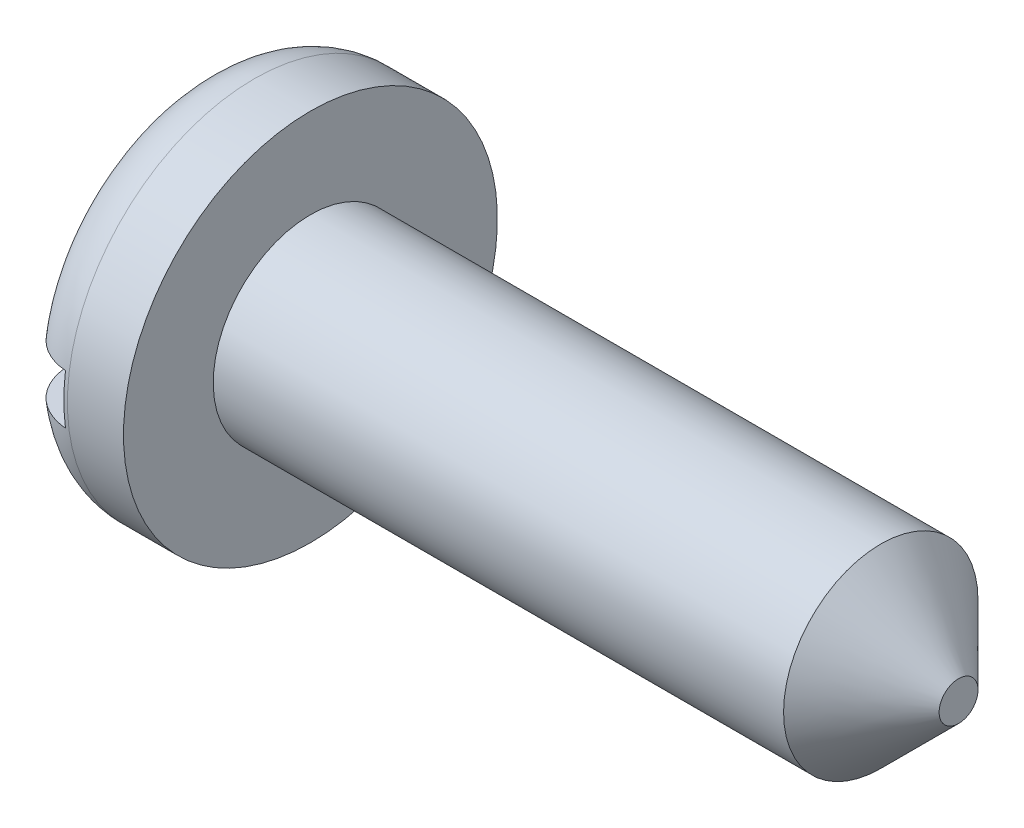
ISO-10303-21;
HEADER;
FILE_DESCRIPTION(('STEP AP214'),'2;1');
FILE_NAME('part.step','',(''),(''),'','','');
FILE_SCHEMA(('AUTOMOTIVE_DESIGN { 1 0 10303 214 1 1 1 1 }'));
ENDSEC;
DATA;
#1=APPLICATION_CONTEXT('core data for automotive mechanical design processes');
#2=APPLICATION_PROTOCOL_DEFINITION('international standard','automotive_design',2000,#1);
#3=PRODUCT_CONTEXT('',#1,'mechanical');
#4=PRODUCT('Part','Part','',(#3));
#5=PRODUCT_RELATED_PRODUCT_CATEGORY('part','',(#4));
#6=PRODUCT_DEFINITION_FORMATION('','',#4);
#7=PRODUCT_DEFINITION_CONTEXT('part definition',#1,'design');
#8=PRODUCT_DEFINITION('design','',#6,#7);
#9=PRODUCT_DEFINITION_SHAPE('','',#8);
#10=(LENGTH_UNIT() NAMED_UNIT(*) SI_UNIT(.MILLI.,.METRE.));
#11=(NAMED_UNIT(*) PLANE_ANGLE_UNIT() SI_UNIT($,.RADIAN.));
#12=(NAMED_UNIT(*) SI_UNIT($,.STERADIAN.) SOLID_ANGLE_UNIT());
#13=UNCERTAINTY_MEASURE_WITH_UNIT(LENGTH_MEASURE(1.E-05),#10,'distance_accuracy_value','');
#14=(GEOMETRIC_REPRESENTATION_CONTEXT(3) GLOBAL_UNCERTAINTY_ASSIGNED_CONTEXT((#13)) GLOBAL_UNIT_ASSIGNED_CONTEXT((#10,
#11,#12)) REPRESENTATION_CONTEXT('',''));
#15=CARTESIAN_POINT('',(0.,0.,0.));
#16=DIRECTION('',(0.,0.,1.));
#17=DIRECTION('',(1.,0.,0.));
#18=AXIS2_PLACEMENT_3D('',#15,#16,#17);
#19=CARTESIAN_POINT('',(0.,0.,0.));
#20=DIRECTION('',(-1.,0.,0.));
#21=DIRECTION('',(0.,-1.,0.));
#22=AXIS2_PLACEMENT_3D('',#19,#20,#21);
#23=PLANE('',#22);
#24=DIRECTION('',(0.,0.,1.));
#25=VECTOR('',#24,1.);
#26=CARTESIAN_POINT('',(0.,0.5,-3.75));
#27=LINE('',#26,#25);
#28=CARTESIAN_POINT('',(0.,0.5,-2.57694101601108));
#29=VERTEX_POINT('',#28);
#30=CARTESIAN_POINT('',(0.,0.5,2.57694101603312));
#31=VERTEX_POINT('',#30);
#32=EDGE_CURVE('E125',#29,#31,#27,.T.);
#33=ORIENTED_EDGE('',*,*,#32,.T.);
#34=CARTESIAN_POINT('',(0.,0.,0.));
#35=DIRECTION('',(1.,0.,0.));
#36=DIRECTION('',(0.,1.,0.));
#37=AXIS2_PLACEMENT_3D('',#34,#35,#36);
#38=CIRCLE('',#37,2.625);
#39=EDGE_CURVE('E122',#29,#31,#38,.T.);
#40=ORIENTED_EDGE('',*,*,#39,.F.);
#41=EDGE_LOOP('',(#33,#40));
#42=FACE_BOUND('',#41,.T.);
#43=ADVANCED_FACE('F35',(#42),#23,.T.);
#44=DIRECTION('',(0.,0.,1.));
#45=VECTOR('',#44,1.);
#46=CARTESIAN_POINT('',(0.,-0.5,-3.75));
#47=LINE('',#46,#45);
#48=CARTESIAN_POINT('',(0.,-0.5,-2.57694101601097));
#49=VERTEX_POINT('',#48);
#50=CARTESIAN_POINT('',(0.,-0.5,2.57694101601104));
#51=VERTEX_POINT('',#50);
#52=EDGE_CURVE('E54',#49,#51,#47,.T.);
#53=ORIENTED_EDGE('',*,*,#52,.F.);
#54=EDGE_CURVE('E99',#51,#49,#38,.T.);
#55=ORIENTED_EDGE('',*,*,#54,.F.);
#56=EDGE_LOOP('',(#53,#55));
#57=FACE_BOUND('',#56,.T.);
#58=ADVANCED_FACE('F37',(#57),#23,.T.);
#59=CARTESIAN_POINT('',(1.125,0.,0.));
#60=DIRECTION('',(1.,0.,0.));
#61=DIRECTION('',(0.,1.,0.));
#62=AXIS2_PLACEMENT_3D('',#59,#60,#61);
#63=TOROIDAL_SURFACE('',#62,2.625,1.125);
#64=CARTESIAN_POINT('',(0.387113342126184,0.5,-3.43803677944572));
#65=CARTESIAN_POINT('',(0.434386925788926,0.5,-3.47954204280355));
#66=CARTESIAN_POINT('',(0.485179621424907,0.5,-3.51710510253335));
#67=CARTESIAN_POINT('',(0.592385882182379,0.5,-3.58321117969082));
#68=CARTESIAN_POINT('',(0.648805611983186,0.5,-3.61174415826385));
#69=CARTESIAN_POINT('',(0.765634175855964,0.5,-3.65890849085831));
#70=CARTESIAN_POINT('',(0.826042085530672,0.5,-3.67754213039494));
#71=CARTESIAN_POINT('',(0.949119633830516,0.5,-3.70435713029077));
#72=CARTESIAN_POINT('',(1.01178873700623,0.5,-3.71254094867501));
#73=CARTESIAN_POINT('',(1.13739415621594,0.5,-3.71821324883663));
#74=CARTESIAN_POINT('',(1.20032882767426,0.5,-3.71573817784153));
#75=CARTESIAN_POINT('',(1.32488857672405,0.5,-3.70024805868136));
#76=CARTESIAN_POINT('',(1.38651362480781,0.5,-3.68723277328772));
#77=CARTESIAN_POINT('',(1.50665928881251,0.5,-3.65105913284067));
#78=CARTESIAN_POINT('',(1.56518220035281,0.5,-3.62790839902147));
#79=CARTESIAN_POINT('',(1.67752908559488,0.5,-3.57214361585745));
#80=CARTESIAN_POINT('',(1.73135302745405,0.5,-3.53952950239045));
#81=CARTESIAN_POINT('',(1.8329887386624,0.5,-3.46565456694719));
#82=CARTESIAN_POINT('',(1.88077854842333,0.5,-3.42436354170049));
#83=CARTESIAN_POINT('',(1.96881308744903,0.5,-3.3344010572579));
#84=CARTESIAN_POINT('',(2.0090576089498,0.5,-3.2857293948985));
#85=CARTESIAN_POINT('',(2.08121441701174,0.5,-3.18198534354642));
#86=CARTESIAN_POINT('',(2.11305818681427,0.5,-3.12686531312918));
#87=CARTESIAN_POINT('',(2.16716674672113,0.5,-3.0121111732027));
#88=CARTESIAN_POINT('',(2.1894310299172,0.5,-2.95247682501005));
#89=CARTESIAN_POINT('',(2.22405581985719,0.5,-2.82960638127379));
#90=CARTESIAN_POINT('',(2.23629090163307,0.5,-2.76633495730002));
#91=CARTESIAN_POINT('',(2.25014288643301,0.5,-2.63864221345242));
#92=CARTESIAN_POINT('',(2.25175896368406,0.5,-2.57422080454209));
#93=CARTESIAN_POINT('',(2.24435646268901,0.5,-2.44497018986624));
#94=CARTESIAN_POINT('',(2.23516932915264,0.5,-2.3801506420155));
#95=CARTESIAN_POINT('',(2.20621299443233,0.5,-2.25291932900213));
#96=CARTESIAN_POINT('',(2.18644274878724,0.5,-2.19050780214211));
#97=CARTESIAN_POINT('',(2.13652626134136,0.5,-2.06886399740032));
#98=CARTESIAN_POINT('',(2.10622638742327,0.5,-2.00969471556256));
#99=CARTESIAN_POINT('',(2.03616155035014,0.5,-1.89724332290425));
#100=CARTESIAN_POINT('',(1.99639554133454,0.5,-1.84396186354952));
#101=CARTESIAN_POINT('',(1.90828634656005,0.5,-1.74467370372696));
#102=CARTESIAN_POINT('',(1.85991227788149,0.5,-1.69869436402156));
#103=CARTESIAN_POINT('',(1.75595851705557,0.5,-1.61574903696422));
#104=CARTESIAN_POINT('',(1.70037956515273,0.5,-1.57878212477938));
#105=CARTESIAN_POINT('',(1.58502678636872,0.5,-1.51606129342173));
#106=CARTESIAN_POINT('',(1.52539474427035,0.5,-1.49004724247605));
#107=CARTESIAN_POINT('',(1.40246282406672,0.5,-1.44902631984458));
#108=CARTESIAN_POINT('',(1.33916465281042,0.5,-1.4340143696317));
#109=CARTESIAN_POINT('',(1.21421583517915,0.5,-1.41619435385486));
#110=CARTESIAN_POINT('',(1.15264909394011,0.5,-1.41279570526636));
#111=CARTESIAN_POINT('',(1.02986250007152,0.5,-1.41670518845499));
#112=CARTESIAN_POINT('',(0.968642597789495,0.5,-1.4240117467266));
#113=CARTESIAN_POINT('',(0.849990661667598,0.5,-1.44864629575248));
#114=CARTESIAN_POINT('',(0.792501029273767,0.5,-1.46569933372191));
#115=CARTESIAN_POINT('',(0.681063095624299,0.5,-1.50892272243319));
#116=CARTESIAN_POINT('',(0.627115359734585,0.5,-1.53509452454911));
#117=CARTESIAN_POINT('',(0.52243449914082,0.5,-1.5965947344074));
#118=CARTESIAN_POINT('',(0.471855122164556,0.5,-1.63218442095962));
#119=CARTESIAN_POINT('',(0.377014710093808,0.5,-1.71096705291018));
#120=CARTESIAN_POINT('',(0.332755094218686,0.5,-1.75416170129551));
#121=CARTESIAN_POINT('',(0.249514976181664,0.5,-1.84929651217718));
#122=CARTESIAN_POINT('',(0.210911772894671,0.5,-1.90156718756695));
#123=CARTESIAN_POINT('',(0.142761497419512,0.5,-2.01171464513227));
#124=CARTESIAN_POINT('',(0.113215803839431,0.5,-2.06959227895849));
#125=CARTESIAN_POINT('',(0.0633337056954972,0.5,-2.19095138936336));
#126=CARTESIAN_POINT('',(0.0432549389439985,0.5,-2.25453900989198));
#127=CARTESIAN_POINT('',(0.0140828268822898,0.5,-2.38418666017005));
#128=CARTESIAN_POINT('',(0.00498917796935834,0.5,-2.45024662153781));
#129=CARTESIAN_POINT('',(-0.0018626454623593,0.5,-2.58279810050606));
#130=CARTESIAN_POINT('',(0.000352160041173481,0.5,-2.64928821066037));
#131=CARTESIAN_POINT('',(0.0160926052607067,0.5,-2.78093681363227));
#132=CARTESIAN_POINT('',(0.0296202998087995,0.5,-2.8460950623326));
#133=CARTESIAN_POINT('',(0.0674001010843154,0.5,-2.97218415767109));
#134=CARTESIAN_POINT('',(0.0914930888549296,0.5,-3.0331627638838));
#135=CARTESIAN_POINT('',(0.149726751937008,0.5,-3.15005436864323));
#136=CARTESIAN_POINT('',(0.183854210075721,0.5,-3.20597390497096));
#137=CARTESIAN_POINT('',(0.246604491147156,0.5,-3.29128786188416));
#138=CARTESIAN_POINT('',(0.272469336805701,0.5,-3.32274779867961));
#139=CARTESIAN_POINT('',(0.327436586314176,0.5,-3.38270039308697));
#140=CARTESIAN_POINT('',(0.356538958020587,0.5,-3.41119308015354));
#141=CARTESIAN_POINT('',(0.387113342126184,0.5,-3.43803677944572));
#142=B_SPLINE_CURVE_WITH_KNOTS('',3,(#64,#65,#66,#67,#68,#69,#70,#71,#72,#73,#74,#75,#76,#77,
#78,#79,#80,#81,#82,#83,#84,#85,#86,#87,#88,#89,#90,#91,#92,#93,#94,#95,#96,#97,#98,#99,#100,
#101,#102,#103,#104,#105,#106,#107,#108,#109,#110,#111,#112,#113,#114,#115,#116,#117,#118,#119,
#120,#121,#122,#123,#124,#125,#126,#127,#128,#129,#130,#131,#132,#133,#134,#135,#136,#137,#138,
#139,#140,#141),.UNSPECIFIED.,.T.,.F.,(4,2,2,2,2,2,2,2,2,2,2,2,2,2,2,2,2,2,2,2,2,2,2,2,2,2,2,2,
2,2,2,2,2,2,2,2,2,2,4),(0.,0.188578115832923,0.377365145827363,0.566108570552244,
0.75480759053804,0.942861882448969,1.13092040701483,1.31883776535347,1.50675639701673,
1.69534031934752,1.88392943368606,2.07401219617986,2.26410501585943,2.45654034496394,
2.6489906383734,2.84448388498871,3.03999642864568,3.23849045844544,3.43700642893231,
3.6362495223167,3.8354721612563,4.02965222399208,4.22374259741186,4.40780273529168,
4.59183582179446,4.77091684288466,4.95002638016084,5.1347496063537,5.31951425054417,
5.51356835323236,5.70765197748775,5.90674967334539,6.10584186648688,6.30445857948325,
6.50311137633583,6.69886993511543,6.8943717915923,7.01633667218759,7.13830034197236),.UNSPECIFIED.);
#143=CARTESIAN_POINT('',(1.05,0.5,-3.7139918395399));
#144=VERTEX_POINT('',#143);
#145=EDGE_CURVE('E11',#29,#144,#142,.T.);
#146=ORIENTED_EDGE('',*,*,#145,.F.);
#147=ORIENTED_EDGE('',*,*,#39,.T.);
#148=CARTESIAN_POINT('',(0.38477456420239,0.5,1.70607487542206));
#149=CARTESIAN_POINT('',(0.431196153858509,0.5,1.66380952310481));
#150=CARTESIAN_POINT('',(0.481076614602096,0.5,1.62529179988825));
#151=CARTESIAN_POINT('',(0.58655428032638,0.5,1.55699766827834));
#152=CARTESIAN_POINT('',(0.642155807024301,0.5,1.52722793458422));
#153=CARTESIAN_POINT('',(0.757733023896927,0.5,1.47751619894176));
#154=CARTESIAN_POINT('',(0.817716435910863,0.5,1.45759205119296));
#155=CARTESIAN_POINT('',(0.940229243566754,0.5,1.42853761601634));
#156=CARTESIAN_POINT('',(1.00275744406151,0.5,1.41940232081342));
#157=CARTESIAN_POINT('',(1.12619774736085,0.5,1.41247937431439));
#158=CARTESIAN_POINT('',(1.18708803465694,0.5,1.41429893698343));
#159=CARTESIAN_POINT('',(1.30766476360563,0.5,1.42828577848575));
#160=CARTESIAN_POINT('',(1.36735119406636,0.5,1.44045315347403));
#161=CARTESIAN_POINT('',(1.48310281571869,0.5,1.47438181859181));
#162=CARTESIAN_POINT('',(1.5392039813308,0.5,1.49602112114135));
#163=CARTESIAN_POINT('',(1.64718951226075,0.5,1.54804175655235));
#164=CARTESIAN_POINT('',(1.69907310539188,0.5,1.57842468566396));
#165=CARTESIAN_POINT('',(1.7994579235065,0.5,1.6483634248421));
#166=CARTESIAN_POINT('',(1.84773146464826,0.5,1.68824581162298));
#167=CARTESIAN_POINT('',(1.9372808393208,0.5,1.77521487374871));
#168=CARTESIAN_POINT('',(1.97855514491368,0.5,1.82230311788003));
#169=CARTESIAN_POINT('',(2.05489569425529,0.5,1.92476289395861));
#170=CARTESIAN_POINT('',(2.0895802880954,0.5,1.98041922290162));
#171=CARTESIAN_POINT('',(2.14931190613252,0.5,2.09668632386849));
#172=CARTESIAN_POINT('',(2.17435780301688,0.5,2.15729767441209));
#173=CARTESIAN_POINT('',(2.21446320618797,0.5,2.28295764970153));
#174=CARTESIAN_POINT('',(2.22933381639414,0.5,2.34806671927608));
#175=CARTESIAN_POINT('',(2.24785293528108,0.5,2.47986462776509));
#176=CARTESIAN_POINT('',(2.25150162316406,0.5,2.54655344143557));
#177=CARTESIAN_POINT('',(2.24739365291879,0.5,2.67912541198997));
#178=CARTESIAN_POINT('',(2.23971493915871,0.5,2.745010958522));
#179=CARTESIAN_POINT('',(2.21321960108012,0.5,2.87450530450011));
#180=CARTESIAN_POINT('',(2.19440384981551,0.5,2.93811428199637));
#181=CARTESIAN_POINT('',(2.14649205042355,0.5,3.06015646314697));
#182=CARTESIAN_POINT('',(2.11756594587794,0.5,3.11865638030331));
#183=CARTESIAN_POINT('',(2.05015468918503,0.5,3.22986312794928));
#184=CARTESIAN_POINT('',(2.011670345648,0.5,3.28257044793868));
#185=CARTESIAN_POINT('',(1.92688394114966,0.5,3.37983875195987));
#186=CARTESIAN_POINT('',(1.88071161127691,0.5,3.42451284254094));
#187=CARTESIAN_POINT('',(1.78144701869622,0.5,3.50536621573737));
#188=CARTESIAN_POINT('',(1.72835521172539,0.5,3.5415460573697));
#189=CARTESIAN_POINT('',(1.61741514314395,0.5,3.60396243293993));
#190=CARTESIAN_POINT('',(1.55962791450835,0.5,3.63030748045217));
#191=CARTESIAN_POINT('',(1.44043078709124,0.5,3.67284646997378));
#192=CARTESIAN_POINT('',(1.37902104269984,0.5,3.68904084425912));
#193=CARTESIAN_POINT('',(1.25477024297837,0.5,3.71072116349236));
#194=CARTESIAN_POINT('',(1.19194172486156,0.5,3.71627901356467));
#195=CARTESIAN_POINT('',(1.06624617493485,0.5,3.71674032767781));
#196=CARTESIAN_POINT('',(1.00337914391597,0.5,3.71164400366765));
#197=CARTESIAN_POINT('',(0.879545790448926,0.5,3.69097260801632));
#198=CARTESIAN_POINT('',(0.818575338004862,0.5,3.6754222583848));
#199=CARTESIAN_POINT('',(0.700103469906428,0.5,3.63432507233369));
#200=CARTESIAN_POINT('',(0.642602053611705,0.5,3.60877823775937));
#201=CARTESIAN_POINT('',(0.532573222056681,0.5,3.54837622231277));
#202=CARTESIAN_POINT('',(0.480055581720927,0.5,3.51350324077525));
#203=CARTESIAN_POINT('',(0.381575044715946,0.5,3.43548604723652));
#204=CARTESIAN_POINT('',(0.335612293935941,0.5,3.39234165119226));
#205=CARTESIAN_POINT('',(0.251225954388227,0.5,3.29873005880968));
#206=CARTESIAN_POINT('',(0.212851272882775,0.5,3.24821878691934));
#207=CARTESIAN_POINT('',(0.145023398658163,0.5,3.14152698461114));
#208=CARTESIAN_POINT('',(0.115570620875741,0.5,3.08534619067909));
#209=CARTESIAN_POINT('',(0.066070776201709,0.5,2.96827422680865));
#210=CARTESIAN_POINT('',(0.0461278136966792,0.5,2.90733905610139));
#211=CARTESIAN_POINT('',(0.0165936272418318,0.5,2.78301439178051));
#212=CARTESIAN_POINT('',(0.00700270587413883,0.5,2.71962482648293));
#213=CARTESIAN_POINT('',(-0.00171610312962944,0.5,2.59119908925962));
#214=CARTESIAN_POINT('',(-0.00068878047842733,0.5,2.52615239680266));
#215=CARTESIAN_POINT('',(0.0120889674547963,0.5,2.39710545563605));
#216=CARTESIAN_POINT('',(0.0238428117083471,0.5,2.33310554719948));
#217=CARTESIAN_POINT('',(0.0579670274256343,0.5,2.20685648423254));
#218=CARTESIAN_POINT('',(0.0805115577057774,0.5,2.14465446980446));
#219=CARTESIAN_POINT('',(0.135608315179068,0.5,2.02490382498222));
#220=CARTESIAN_POINT('',(0.168150984153624,0.5,1.96735081622128));
#221=CARTESIAN_POINT('',(0.231000246881695,0.5,1.87511083998548));
#222=CARTESIAN_POINT('',(0.258962207725174,0.5,1.83880314972501));
#223=CARTESIAN_POINT('',(0.318928189263544,0.5,1.76969133306033));
#224=CARTESIAN_POINT('',(0.350932229696052,0.5,1.73688722376568));
#225=CARTESIAN_POINT('',(0.38477456420239,0.5,1.70607487542206));
#226=B_SPLINE_CURVE_WITH_KNOTS('',3,(#148,#149,#150,#151,#152,#153,#154,#155,#156,#157,#158,
#159,#160,#161,#162,#163,#164,#165,#166,#167,#168,#169,#170,#171,#172,#173,#174,#175,#176,#177,
#178,#179,#180,#181,#182,#183,#184,#185,#186,#187,#188,#189,#190,#191,#192,#193,#194,#195,#196,
#197,#198,#199,#200,#201,#202,#203,#204,#205,#206,#207,#208,#209,#210,#211,#212,#213,#214,#215,
#216,#217,#218,#219,#220,#221,#222,#223,#224,#225),.UNSPECIFIED.,.T.,.F.,(4,2,2,2,2,2,2,2,2,2,2,
2,2,2,2,2,2,2,2,2,2,2,2,2,2,2,2,2,2,2,2,2,2,2,2,2,2,2,4),(0.,0.188183840185214,
0.376510893666662,0.56517822158138,0.753757942835729,0.935617392508916,1.11747853209365,
1.29706342204028,1.47668111810629,1.66370518361924,1.85077002420187,2.04660271978481,
2.24245831240786,2.44185776074876,2.64125402487496,2.83928461856353,3.03729969030652,
3.23213484033284,3.42695351325777,3.6187674068554,3.81056867340379,4.0001863123329,
4.18979587566796,4.37811904731837,4.56643847259378,4.7543141134519,4.94218971962978,
5.13042651239188,5.31866749400181,5.50808479799228,5.69751090998362,5.88896560329144,
6.08042589251976,6.27468873010877,6.46901350866985,6.66658618802696,6.86397057259464,
7.00115995831705,7.13835001396599),.UNSPECIFIED.);
#227=CARTESIAN_POINT('',(1.05,0.5,3.7139918395399));
#228=VERTEX_POINT('',#227);
#229=EDGE_CURVE('E62',#228,#31,#226,.T.);
#230=ORIENTED_EDGE('',*,*,#229,.F.);
#231=CARTESIAN_POINT('',(1.05,0.,0.));
#232=DIRECTION('',(1.,0.,0.));
#233=DIRECTION('',(0.,0.,-1.));
#234=AXIS2_PLACEMENT_3D('',#231,#232,#233);
#235=CIRCLE('',#234,3.74749721603218);
#236=CARTESIAN_POINT('',(1.05,-0.5,3.7139918395399));
#237=VERTEX_POINT('',#236);
#238=EDGE_CURVE('E91',#237,#228,#235,.F.);
#239=ORIENTED_EDGE('',*,*,#238,.F.);
#240=CARTESIAN_POINT('',(0.38477456420239,-0.5,1.70607487542206));
#241=CARTESIAN_POINT('',(0.335837100967663,-0.5,1.7506367713812));
#242=CARTESIAN_POINT('',(0.290674525672225,-0.5,1.79943028641121));
#243=CARTESIAN_POINT('',(0.209133860992827,-0.5,1.90395692401157));
#244=CARTESIAN_POINT('',(0.172770197702916,-0.5,1.95970121892932));
#245=CARTESIAN_POINT('',(0.109894027338731,-0.5,2.07643410838833));
#246=CARTESIAN_POINT('',(0.0833723467602543,-0.5,2.1374177538034));
#247=CARTESIAN_POINT('',(0.0409109204338173,-0.5,2.26293822915607));
#248=CARTESIAN_POINT('',(0.0249671241084215,-0.5,2.32747368873749));
#249=CARTESIAN_POINT('',(0.00412065356335135,-0.5,2.45854839898882));
#250=CARTESIAN_POINT('',(-0.000742005606129053,-0.5,2.52509403525539));
#251=CARTESIAN_POINT('',(0.000925429360869497,-0.5,2.65805009976923));
#252=CARTESIAN_POINT('',(0.00745576210919907,-0.5,2.72446052515553));
#253=CARTESIAN_POINT('',(0.0316598916703482,-0.5,2.85434444982189));
#254=CARTESIAN_POINT('',(0.0491905638738566,-0.5,2.91784459728988));
#255=CARTESIAN_POINT('',(0.0948430911966869,-0.5,3.0409174687564));
#256=CARTESIAN_POINT('',(0.122963952989827,-0.5,3.10049056048467));
#257=CARTESIAN_POINT('',(0.188491706409179,-0.5,3.21297183916255));
#258=CARTESIAN_POINT('',(0.225737558113487,-0.5,3.26597385393824));
#259=CARTESIAN_POINT('',(0.308714348209054,-0.5,3.36485889538967));
#260=CARTESIAN_POINT('',(0.354444615547168,-0.5,3.41074248455244));
#261=CARTESIAN_POINT('',(0.452404087449812,-0.5,3.49342749585979));
#262=CARTESIAN_POINT('',(0.50453491493922,-0.5,3.53034549658663));
#263=CARTESIAN_POINT('',(0.614301548894863,-0.5,3.5948083996042));
#264=CARTESIAN_POINT('',(0.671937056912233,-0.5,3.62235380968236));
#265=CARTESIAN_POINT('',(0.790495451823624,-0.5,3.66703474593342));
#266=CARTESIAN_POINT('',(0.851382669797226,-0.5,3.68426495444631));
#267=CARTESIAN_POINT('',(0.975191142177751,-0.5,3.70820395244153));
#268=CARTESIAN_POINT('',(1.0381123297393,-0.5,3.71491308733553));
#269=CARTESIAN_POINT('',(1.1638816801928,-0.5,3.71760450538687));
#270=CARTESIAN_POINT('',(1.22672875630185,-0.5,3.71363787311785));
#271=CARTESIAN_POINT('',(1.35086270816845,-0.5,3.69520401700621));
#272=CARTESIAN_POINT('',(1.41214960047862,-0.5,3.68073690461558));
#273=CARTESIAN_POINT('',(1.53140107054821,-0.5,3.64173654767625));
#274=CARTESIAN_POINT('',(1.58936708868906,-0.5,3.61720770551121));
#275=CARTESIAN_POINT('',(1.70037937624674,-0.5,3.55880213262796));
#276=CARTESIAN_POINT('',(1.75342559805268,-0.5,3.52492531145812));
#277=CARTESIAN_POINT('',(1.85332146011089,-0.5,3.44866031679855));
#278=CARTESIAN_POINT('',(1.90014651481725,-0.5,3.40623994866203));
#279=CARTESIAN_POINT('',(1.98607974719181,-0.5,3.31419733187605));
#280=CARTESIAN_POINT('',(2.02518768703299,-0.5,3.26457486135305));
#281=CARTESIAN_POINT('',(2.09493526815582,-0.5,3.15910985758707));
#282=CARTESIAN_POINT('',(2.12550254698571,-0.5,3.10321948276233));
#283=CARTESIAN_POINT('',(2.17695120450931,-0.5,2.9871480882414));
#284=CARTESIAN_POINT('',(2.19783206458472,-0.5,2.92696683900748));
#285=CARTESIAN_POINT('',(2.22961042061809,-0.5,2.80321498061531));
#286=CARTESIAN_POINT('',(2.24037862637689,-0.5,2.73961118699181));
#287=CARTESIAN_POINT('',(2.25126398655584,-0.5,2.61150041126246));
#288=CARTESIAN_POINT('',(2.2513802857532,-0.5,2.54699335705126));
#289=CARTESIAN_POINT('',(2.24096101401761,-0.5,2.41780902828422));
#290=CARTESIAN_POINT('',(2.2302553928763,-0.5,2.35314547131877));
#291=CARTESIAN_POINT('',(2.19830529067463,-0.5,2.2264757399568));
#292=CARTESIAN_POINT('',(2.17705976704895,-0.5,2.16446982910339));
#293=CARTESIAN_POINT('',(2.12425818069049,-0.5,2.04390753517992));
#294=CARTESIAN_POINT('',(2.09255319640687,-0.5,1.98541632215712));
#295=CARTESIAN_POINT('',(2.01979747424467,-0.5,1.87455602089188));
#296=CARTESIAN_POINT('',(1.9787457142182,-0.5,1.8221876031769));
#297=CARTESIAN_POINT('',(1.88827728930393,-0.5,1.72502684380826));
#298=CARTESIAN_POINT('',(1.83884240933489,-0.5,1.68025143345946));
#299=CARTESIAN_POINT('',(1.73297371898438,-0.5,1.59990594788869));
#300=CARTESIAN_POINT('',(1.67654081817413,-0.5,1.56433467820521));
#301=CARTESIAN_POINT('',(1.55988789575316,-0.5,1.50461030019024));
#302=CARTESIAN_POINT('',(1.49981644325939,-0.5,1.48016770315718));
#303=CARTESIAN_POINT('',(1.37629382075351,-0.5,1.44235064537269));
#304=CARTESIAN_POINT('',(1.31284438585861,-0.5,1.42897055959094));
#305=CARTESIAN_POINT('',(1.18792365562116,-0.5,1.41431796993299));
#306=CARTESIAN_POINT('',(1.12652170344208,-0.5,1.41245057230345));
#307=CARTESIAN_POINT('',(1.00430269890579,-0.5,1.41932632139731));
#308=CARTESIAN_POINT('',(0.943485735744348,-0.5,1.42807106113805));
#309=CARTESIAN_POINT('',(0.825592329676827,-0.5,1.45544894510393));
#310=CARTESIAN_POINT('',(0.768462431647918,-0.5,1.47385432893538));
#311=CARTESIAN_POINT('',(0.657994853498541,-0.5,1.51966833520097));
#312=CARTESIAN_POINT('',(0.604653303609197,-0.5,1.54706760474596));
#313=CARTESIAN_POINT('',(0.523761250123195,-0.5,1.59706670917947));
#314=CARTESIAN_POINT('',(0.494566687993588,-0.5,1.61706447326403));
#315=CARTESIAN_POINT('',(0.43814708346878,-0.5,1.65966380854239));
#316=CARTESIAN_POINT('',(0.410921996933609,-0.5,1.68226532135142));
#317=CARTESIAN_POINT('',(0.38477456420239,-0.5,1.70607487542206));
#318=B_SPLINE_CURVE_WITH_KNOTS('',3,(#240,#241,#242,#243,#244,#245,#246,#247,#248,#249,#250,
#251,#252,#253,#254,#255,#256,#257,#258,#259,#260,#261,#262,#263,#264,#265,#266,#267,#268,#269,
#270,#271,#272,#273,#274,#275,#276,#277,#278,#279,#280,#281,#282,#283,#284,#285,#286,#287,#288,
#289,#290,#291,#292,#293,#294,#295,#296,#297,#298,#299,#300,#301,#302,#303,#304,#305,#306,#307,
#308,#309,#310,#311,#312,#313,#314,#315,#316,#317),.UNSPECIFIED.,.T.,.F.,(4,2,2,2,2,2,2,2,2,2,2,
2,2,2,2,2,2,2,2,2,2,2,2,2,2,2,2,2,2,2,2,2,2,2,2,2,2,2,4),(0.,0.198427574067746,
0.397178304925035,0.59574331633292,0.794232247507962,0.993436813105738,1.19264555084205,
1.38931466153803,1.58596532988806,1.77936809474747,1.97275556942601,2.16347472381507,
2.35418354379178,2.54311389994113,2.73203805329038,2.92005979562813,3.10807954233444,
3.29601711095863,3.48395649814213,3.67261781373797,3.8612849426144,4.05150520489236,
4.24173565053403,4.43436634406689,4.62701250356481,4.82273359836561,5.01847405698176,
5.21713127571408,5.41581022971402,5.61492654398787,5.81401700509365,6.00758214039464,
6.20104879167896,6.38442846631465,6.56783567198678,6.74710115665982,6.92618080769864,
7.03220362994284,7.1382240752624),.UNSPECIFIED.);
#319=EDGE_CURVE('E93',#51,#237,#318,.T.);
#320=ORIENTED_EDGE('',*,*,#319,.F.);
#321=ORIENTED_EDGE('',*,*,#54,.T.);
#322=CARTESIAN_POINT('',(0.387113342126184,-0.5,-3.43803677944572));
#323=CARTESIAN_POINT('',(0.339165841659024,-0.5,-3.39593210740683));
#324=CARTESIAN_POINT('',(0.294768285311616,-0.5,-3.34970840382547));
#325=CARTESIAN_POINT('',(0.214359658225265,-0.5,-3.25039995887547));
#326=CARTESIAN_POINT('',(0.178359870379981,-0.5,-3.19730613421631));
#327=CARTESIAN_POINT('',(0.115793877386649,-0.5,-3.08589361286469));
#328=CARTESIAN_POINT('',(0.0892179760921531,-0.5,-3.02758036423336));
#329=CARTESIAN_POINT('',(0.0461326263735077,-0.5,-2.90737032251895));
#330=CARTESIAN_POINT('',(0.0296206648867763,-0.5,-2.8454744282875));
#331=CARTESIAN_POINT('',(0.006906402461004,-0.5,-2.71916608339757));
#332=CARTESIAN_POINT('',(0.000811415773582635,-0.5,-2.65473435205778));
#333=CARTESIAN_POINT('',(-0.000659855684353151,-0.5,-2.52574732424214));
#334=CARTESIAN_POINT('',(0.00396520863405121,-0.5,-2.46119201323567));
#335=CARTESIAN_POINT('',(0.0238895096888888,-0.5,-2.33267184653385));
#336=CARTESIAN_POINT('',(0.0393615247014604,-0.5,-2.26873377159587));
#337=CARTESIAN_POINT('',(0.0806736616802585,-0.5,-2.14429756177339));
#338=CARTESIAN_POINT('',(0.106514848613604,-0.5,-2.08379978095363));
#339=CARTESIAN_POINT('',(0.168250597847704,-0.5,-1.96712322772477));
#340=CARTESIAN_POINT('',(0.204275434211014,-0.5,-1.91101331925069));
#341=CARTESIAN_POINT('',(0.285257915914983,-0.5,-1.8056448355725));
#342=CARTESIAN_POINT('',(0.330216352506318,-0.5,-1.75638686790355));
#343=CARTESIAN_POINT('',(0.427738280689752,-0.5,-1.66639189311629));
#344=CARTESIAN_POINT('',(0.480278365204614,-0.5,-1.62562957086767));
#345=CARTESIAN_POINT('',(0.591661730814401,-0.5,-1.55387688722246));
#346=CARTESIAN_POINT('',(0.65050352959395,-0.5,-1.52288423449797));
#347=CARTESIAN_POINT('',(0.770635084478977,-0.5,-1.47285074926611));
#348=CARTESIAN_POINT('',(0.831764480263106,-0.5,-1.45342571353555));
#349=CARTESIAN_POINT('',(0.956494675928919,-0.5,-1.4257449730371));
#350=CARTESIAN_POINT('',(1.02009438127316,-0.5,-1.41748437834857));
#351=CARTESIAN_POINT('',(1.14446663419095,-0.5,-1.41266143338296));
#352=CARTESIAN_POINT('',(1.20521747549553,-0.5,-1.41552257213411));
#353=CARTESIAN_POINT('',(1.3253449549127,-0.5,-1.43152383838799));
#354=CARTESIAN_POINT('',(1.38472161887035,-0.5,-1.44466377240865));
#355=CARTESIAN_POINT('',(1.49986687935287,-0.5,-1.48046952908269));
#356=CARTESIAN_POINT('',(1.55566538214347,-0.5,-1.50303973383531));
#357=CARTESIAN_POINT('',(1.66290887671711,-0.5,-1.55684709586358));
#358=CARTESIAN_POINT('',(1.71435303429272,-0.5,-1.58808590899263));
#359=CARTESIAN_POINT('',(1.81379747147834,-0.5,-1.65973811424976));
#360=CARTESIAN_POINT('',(1.8615556450436,-0.5,-1.70048734341322));
#361=CARTESIAN_POINT('',(1.9499349325995,-0.5,-1.78910324068685));
#362=CARTESIAN_POINT('',(1.99055449548146,-0.5,-1.83697145147933));
#363=CARTESIAN_POINT('',(2.06538541516165,-0.5,-1.94087197670449));
#364=CARTESIAN_POINT('',(2.09921715087522,-0.5,-1.9971781395761));
#365=CARTESIAN_POINT('',(2.15713109222378,-0.5,-2.11460213672292));
#366=CARTESIAN_POINT('',(2.18121223721007,-0.5,-2.1757204935952));
#367=CARTESIAN_POINT('',(2.21924741721416,-0.5,-2.30214356190063));
#368=CARTESIAN_POINT('',(2.23302730516082,-0.5,-2.36750080663588));
#369=CARTESIAN_POINT('',(2.2493287423424,-0.5,-2.49960748095261));
#370=CARTESIAN_POINT('',(2.25185051779924,-0.5,-2.56635688253285));
#371=CARTESIAN_POINT('',(2.2454941122572,-0.5,-2.69880164164307));
#372=CARTESIAN_POINT('',(2.23670311784485,-0.5,-2.76450115661936));
#373=CARTESIAN_POINT('',(2.20802972536919,-0.5,-2.89343560944766));
#374=CARTESIAN_POINT('',(2.18814822586473,-0.5,-2.95667074652093));
#375=CARTESIAN_POINT('',(2.13820432291326,-0.5,-3.07778617456921));
#376=CARTESIAN_POINT('',(2.10831198730025,-0.5,-3.13573659402946));
#377=CARTESIAN_POINT('',(2.03907764064205,-0.5,-3.24568872680228));
#378=CARTESIAN_POINT('',(1.99973640451081,-0.5,-3.29769092741831));
#379=CARTESIAN_POINT('',(1.91337761503899,-0.5,-3.39343401836516));
#380=CARTESIAN_POINT('',(1.86648644174111,-0.5,-3.43728892540884));
#381=CARTESIAN_POINT('',(1.76593517890578,-0.5,-3.51639596234524));
#382=CARTESIAN_POINT('',(1.71227551419116,-0.5,-3.55164863174828));
#383=CARTESIAN_POINT('',(1.60035946261842,-0.5,-3.61214948434863));
#384=CARTESIAN_POINT('',(1.54216093832165,-0.5,-3.6375047362081));
#385=CARTESIAN_POINT('',(1.42231743877327,-0.5,-3.67801020482193));
#386=CARTESIAN_POINT('',(1.36067274700025,-0.5,-3.69316125963037));
#387=CARTESIAN_POINT('',(1.23612650041371,-0.5,-3.7127427831276));
#388=CARTESIAN_POINT('',(1.17323606538595,-0.5,-3.71724405373997));
#389=CARTESIAN_POINT('',(1.04757739833292,-0.5,-3.7155993054874));
#390=CARTESIAN_POINT('',(0.984809199079487,-0.5,-3.70945074355498));
#391=CARTESIAN_POINT('',(0.861309678083026,-0.5,-3.68670707255818));
#392=CARTESIAN_POINT('',(0.800575167550413,-0.5,-3.67012921033252));
#393=CARTESIAN_POINT('',(0.682799226678235,-0.5,-3.62703857527049));
#394=CARTESIAN_POINT('',(0.62575329512256,-0.5,-3.60053818997147));
#395=CARTESIAN_POINT('',(0.538531624800039,-0.5,-3.55075381094605));
#396=CARTESIAN_POINT('',(0.506670275398165,-0.5,-3.53036080156649));
#397=CARTESIAN_POINT('',(0.445161876469334,-0.5,-3.48647253333745));
#398=CARTESIAN_POINT('',(0.415514819567901,-0.5,-3.46297728482039));
#399=CARTESIAN_POINT('',(0.387113342126184,-0.5,-3.43803677944572));
#400=B_SPLINE_CURVE_WITH_KNOTS('',3,(#322,#323,#324,#325,#326,#327,#328,#329,#330,#331,#332,
#333,#334,#335,#336,#337,#338,#339,#340,#341,#342,#343,#344,#345,#346,#347,#348,#349,#350,#351,
#352,#353,#354,#355,#356,#357,#358,#359,#360,#361,#362,#363,#364,#365,#366,#367,#368,#369,#370,
#371,#372,#373,#374,#375,#376,#377,#378,#379,#380,#381,#382,#383,#384,#385,#386,#387,#388,#389,
#390,#391,#392,#393,#394,#395,#396,#397,#398,#399),.UNSPECIFIED.,.T.,.F.,(4,2,2,2,2,2,2,2,2,2,2,
2,2,2,2,2,2,2,2,2,2,2,2,2,2,2,2,2,2,2,2,2,2,2,2,2,2,2,4),(0.,0.191291070158199,
0.382837689529163,0.574186652646182,0.765487814489292,0.958748114439782,1.15203273698771,
1.34846823131135,1.54492390573334,1.74401626024925,1.94312625627913,2.14163418753567,
2.34009552706666,2.53153240215491,2.72288540248236,2.90445496084108,3.08602110152204,
3.2657892966098,3.44559185418271,3.6331007394633,3.82065031725943,4.01680669488463,
4.21298440425836,4.4124079121879,4.61182741285844,4.8097191690639,5.00759489429826,
5.20226650448973,5.3969221549124,5.5886056466556,5.78027711340901,5.96981349458013,
6.15933430753822,6.34759156319195,6.5358937788866,6.72388541652378,6.91164313878792,
7.0249538860786,7.13826425598248),.UNSPECIFIED.);
#401=CARTESIAN_POINT('',(1.05,-0.5,-3.7139918395399));
#402=VERTEX_POINT('',#401);
#403=EDGE_CURVE('E89',#402,#49,#400,.T.);
#404=ORIENTED_EDGE('',*,*,#403,.F.);
#405=EDGE_CURVE('E47',#144,#402,#235,.F.);
#406=ORIENTED_EDGE('',*,*,#405,.F.);
#407=EDGE_LOOP('',(#146,#147,#230,#239,#320,#321,#404,#406));
#408=FACE_BOUND('',#407,.T.);
#409=CARTESIAN_POINT('',(1.125,0.,0.));
#410=DIRECTION('',(1.,0.,0.));
#411=DIRECTION('',(0.,1.,0.));
#412=AXIS2_PLACEMENT_3D('',#409,#410,#411);
#413=CIRCLE('',#412,3.75);
#414=CARTESIAN_POINT('',(1.125,3.75,0.));
#415=VERTEX_POINT('',#414);
#416=EDGE_CURVE('E130',#415,#415,#413,.T.);
#417=ORIENTED_EDGE('',*,*,#416,.F.);
#418=EDGE_LOOP('',(#417));
#419=FACE_BOUND('',#418,.T.);
#420=ADVANCED_FACE('F96',(#408,#419),#63,.T.);
#421=CARTESIAN_POINT('',(15.25,0.,0.));
#422=DIRECTION('',(1.,0.,0.));
#423=DIRECTION('',(0.,1.,0.));
#424=AXIS2_PLACEMENT_3D('',#421,#422,#423);
#425=CYLINDRICAL_SURFACE('',#424,3.75);
#426=ORIENTED_EDGE('',*,*,#416,.T.);
#427=EDGE_LOOP('',(#426));
#428=FACE_BOUND('',#427,.T.);
#429=CARTESIAN_POINT('',(2.25,0.,0.));
#430=DIRECTION('',(1.,0.,0.));
#431=DIRECTION('',(0.,1.,0.));
#432=AXIS2_PLACEMENT_3D('',#429,#430,#431);
#433=CIRCLE('',#432,3.75);
#434=CARTESIAN_POINT('',(2.25,3.75,0.));
#435=VERTEX_POINT('',#434);
#436=EDGE_CURVE('E132',#435,#435,#433,.T.);
#437=ORIENTED_EDGE('',*,*,#436,.F.);
#438=EDGE_LOOP('',(#437));
#439=FACE_BOUND('',#438,.T.);
#440=ADVANCED_FACE('F156',(#428,#439),#425,.T.);
#441=CARTESIAN_POINT('',(2.25,3.75,0.));
#442=DIRECTION('',(1.,0.,0.));
#443=DIRECTION('',(0.,1.,0.));
#444=AXIS2_PLACEMENT_3D('',#441,#442,#443);
#445=PLANE('',#444);
#446=ORIENTED_EDGE('',*,*,#436,.T.);
#447=EDGE_LOOP('',(#446));
#448=FACE_BOUND('',#447,.T.);
#449=CARTESIAN_POINT('',(2.25,0.,0.));
#450=DIRECTION('',(1.,0.,0.));
#451=DIRECTION('',(0.,1.,0.));
#452=AXIS2_PLACEMENT_3D('',#449,#450,#451);
#453=CIRCLE('',#452,1.95);
#454=CARTESIAN_POINT('',(2.25,1.95,0.));
#455=VERTEX_POINT('',#454);
#456=EDGE_CURVE('E136',#455,#455,#453,.T.);
#457=ORIENTED_EDGE('',*,*,#456,.F.);
#458=EDGE_LOOP('',(#457));
#459=FACE_BOUND('',#458,.T.);
#460=ADVANCED_FACE('F160',(#448,#459),#445,.T.);
#461=CARTESIAN_POINT('',(15.25,0.,0.));
#462=DIRECTION('',(1.,0.,0.));
#463=DIRECTION('',(0.,1.,0.));
#464=AXIS2_PLACEMENT_3D('',#461,#462,#463);
#465=CYLINDRICAL_SURFACE('',#464,1.95);
#466=ORIENTED_EDGE('',*,*,#456,.T.);
#467=EDGE_LOOP('',(#466));
#468=FACE_BOUND('',#467,.T.);
#469=CARTESIAN_POINT('',(13.69,0.,0.));
#470=DIRECTION('',(1.,0.,0.));
#471=DIRECTION('',(0.,1.,0.));
#472=AXIS2_PLACEMENT_3D('',#469,#470,#471);
#473=CIRCLE('',#472,1.95);
#474=CARTESIAN_POINT('',(13.69,-1.95,0.));
#475=VERTEX_POINT('',#474);
#476=EDGE_CURVE('E141',#475,#475,#473,.T.);
#477=ORIENTED_EDGE('',*,*,#476,.F.);
#478=EDGE_LOOP('',(#477));
#479=FACE_BOUND('',#478,.T.);
#480=ADVANCED_FACE('F164',(#468,#479),#465,.T.);
#481=CARTESIAN_POINT('',(15.25,0.,0.));
#482=DIRECTION('',(-1.,0.,0.));
#483=DIRECTION('',(0.,-1.,0.));
#484=AXIS2_PLACEMENT_3D('',#481,#482,#483);
#485=CONICAL_SURFACE('',#484,0.389999999999998,0.785398163397448);
#486=CARTESIAN_POINT('',(15.25,0.,0.));
#487=DIRECTION('',(1.,0.,0.));
#488=DIRECTION('',(0.,1.,0.));
#489=AXIS2_PLACEMENT_3D('',#486,#487,#488);
#490=CIRCLE('',#489,0.389999999999998);
#491=CARTESIAN_POINT('',(15.25,-0.389999999999996,0.));
#492=VERTEX_POINT('',#491);
#493=EDGE_CURVE('E144',#492,#492,#490,.T.);
#494=CARTESIAN_POINT('',(13.69,-1.95,0.));
#495=CARTESIAN_POINT('',(13.70625,-1.93375,0.));
#496=CARTESIAN_POINT('',(13.7225,-1.9175,0.));
#497=CARTESIAN_POINT('',(13.755,-1.885,0.));
#498=CARTESIAN_POINT('',(13.77125,-1.86875,0.));
#499=CARTESIAN_POINT('',(13.80375,-1.83625,0.));
#500=CARTESIAN_POINT('',(13.82,-1.82,0.));
#501=CARTESIAN_POINT('',(13.8525,-1.7875,0.));
#502=CARTESIAN_POINT('',(13.86875,-1.77125,0.));
#503=CARTESIAN_POINT('',(13.90125,-1.73875,0.));
#504=CARTESIAN_POINT('',(13.9175,-1.7225,0.));
#505=CARTESIAN_POINT('',(13.95,-1.69,0.));
#506=CARTESIAN_POINT('',(13.96625,-1.67375,0.));
#507=CARTESIAN_POINT('',(13.99875,-1.64125,0.));
#508=CARTESIAN_POINT('',(14.015,-1.625,0.));
#509=CARTESIAN_POINT('',(14.0475,-1.5925,0.));
#510=CARTESIAN_POINT('',(14.06375,-1.57625,0.));
#511=CARTESIAN_POINT('',(14.09625,-1.54375,0.));
#512=CARTESIAN_POINT('',(14.1125,-1.5275,0.));
#513=CARTESIAN_POINT('',(14.145,-1.495,0.));
#514=CARTESIAN_POINT('',(14.16125,-1.47875,0.));
#515=CARTESIAN_POINT('',(14.19375,-1.44625,0.));
#516=CARTESIAN_POINT('',(14.21,-1.43,0.));
#517=CARTESIAN_POINT('',(14.2425,-1.3975,0.));
#518=CARTESIAN_POINT('',(14.25875,-1.38125,0.));
#519=CARTESIAN_POINT('',(14.29125,-1.34875,0.));
#520=CARTESIAN_POINT('',(14.3075,-1.3325,0.));
#521=CARTESIAN_POINT('',(14.34,-1.3,0.));
#522=CARTESIAN_POINT('',(14.35625,-1.28375,0.));
#523=CARTESIAN_POINT('',(14.38875,-1.25125,0.));
#524=CARTESIAN_POINT('',(14.405,-1.235,0.));
#525=CARTESIAN_POINT('',(14.4375,-1.2025,0.));
#526=CARTESIAN_POINT('',(14.45375,-1.18625,0.));
#527=CARTESIAN_POINT('',(14.48625,-1.15375,0.));
#528=CARTESIAN_POINT('',(14.5025,-1.1375,0.));
#529=CARTESIAN_POINT('',(14.535,-1.105,0.));
#530=CARTESIAN_POINT('',(14.55125,-1.08875,0.));
#531=CARTESIAN_POINT('',(14.58375,-1.05625,0.));
#532=CARTESIAN_POINT('',(14.6,-1.04,0.));
#533=CARTESIAN_POINT('',(14.6325,-1.0075,0.));
#534=CARTESIAN_POINT('',(14.64875,-0.991249999999996,0.));
#535=CARTESIAN_POINT('',(14.68125,-0.958749999999996,0.));
#536=CARTESIAN_POINT('',(14.6975,-0.942499999999996,0.));
#537=CARTESIAN_POINT('',(14.73,-0.909999999999996,0.));
#538=CARTESIAN_POINT('',(14.74625,-0.893749999999996,0.));
#539=CARTESIAN_POINT('',(14.77875,-0.861249999999996,0.));
#540=CARTESIAN_POINT('',(14.795,-0.844999999999996,0.));
#541=CARTESIAN_POINT('',(14.8275,-0.812499999999996,0.));
#542=CARTESIAN_POINT('',(14.84375,-0.796249999999996,0.));
#543=CARTESIAN_POINT('',(14.87625,-0.763749999999996,0.));
#544=CARTESIAN_POINT('',(14.8925,-0.747499999999996,0.));
#545=CARTESIAN_POINT('',(14.925,-0.714999999999996,0.));
#546=CARTESIAN_POINT('',(14.94125,-0.698749999999996,0.));
#547=CARTESIAN_POINT('',(14.97375,-0.666249999999996,0.));
#548=CARTESIAN_POINT('',(14.99,-0.649999999999996,0.));
#549=CARTESIAN_POINT('',(15.0225,-0.617499999999996,0.));
#550=CARTESIAN_POINT('',(15.03875,-0.601249999999996,0.));
#551=CARTESIAN_POINT('',(15.07125,-0.568749999999996,0.));
#552=CARTESIAN_POINT('',(15.0875,-0.552499999999996,0.));
#553=CARTESIAN_POINT('',(15.12,-0.519999999999996,0.));
#554=CARTESIAN_POINT('',(15.13625,-0.503749999999996,0.));
#555=CARTESIAN_POINT('',(15.16875,-0.471249999999996,0.));
#556=CARTESIAN_POINT('',(15.185,-0.454999999999996,0.));
#557=CARTESIAN_POINT('',(15.2175,-0.422499999999996,0.));
#558=CARTESIAN_POINT('',(15.23375,-0.406249999999996,0.));
#559=CARTESIAN_POINT('',(15.25,-0.389999999999996,0.));
#560=B_SPLINE_CURVE_WITH_KNOTS('',3,(#494,#495,#496,#497,#498,#499,#500,#501,#502,#503,#504,
#505,#506,#507,#508,#509,#510,#511,#512,#513,#514,#515,#516,#517,#518,#519,#520,#521,#522,#523,
#524,#525,#526,#527,#528,#529,#530,#531,#532,#533,#534,#535,#536,#537,#538,#539,#540,#541,#542,
#543,#544,#545,#546,#547,#548,#549,#550,#551,#552,#553,#554,#555,#556,#557,#558,#559),
.UNSPECIFIED.,.F.,.F.,(4,2,2,2,2,2,2,2,2,2,2,2,2,2,2,2,2,2,2,2,2,2,2,2,2,2,2,2,2,2,2,2,4),(0.,
0.0689429111656886,0.137885822331376,0.206828733497064,0.275771644662753,0.344714555828442,
0.41365746699413,0.482600378159818,0.551543289325507,0.620486200491196,0.689429111656884,
0.758372022822573,0.827314933988261,0.89625784515395,0.965200756319638,1.03414366748533,
1.10308657865101,1.1720294898167,1.24097240098239,1.30991531214808,1.37885822331377,
1.44780113447946,1.51674404564515,1.58568695681083,1.65462986797652,1.72357277914221,
1.7925156903079,1.86145860147359,1.93040151263928,1.99934442380496,2.06828733497065,
2.13723024613634,2.20617315730203),.UNSPECIFIED.);
#561=EDGE_CURVE('BSEAM170',#475,#492,#560,.T.);
#562=ORIENTED_EDGE('',*,*,#476,.T.);
#563=ORIENTED_EDGE('',*,*,#493,.F.);
#564=ORIENTED_EDGE('',*,*,#561,.T.);
#565=ORIENTED_EDGE('',*,*,#561,.F.);
#566=EDGE_LOOP('',(#562,#564,#563,#565));
#567=FACE_BOUND('',#566,.T.);
#568=ADVANCED_FACE('F170',(#567),#485,.T.);
#569=CARTESIAN_POINT('',(15.25,0.389999999999999,0.));
#570=DIRECTION('',(1.,0.,0.));
#571=DIRECTION('',(0.,1.,0.));
#572=AXIS2_PLACEMENT_3D('',#569,#570,#571);
#573=PLANE('',#572);
#574=ORIENTED_EDGE('',*,*,#493,.T.);
#575=EDGE_LOOP('',(#574));
#576=FACE_BOUND('',#575,.T.);
#577=ADVANCED_FACE('F114',(#576),#573,.T.);
#578=CARTESIAN_POINT('',(0.,0.5,-3.75));
#579=DIRECTION('',(0.,1.,0.));
#580=DIRECTION('',(0.,0.,1.));
#581=AXIS2_PLACEMENT_3D('',#578,#579,#580);
#582=PLANE('',#581);
#583=ORIENTED_EDGE('',*,*,#145,.T.);
#584=DIRECTION('',(0.,0.,1.));
#585=VECTOR('',#584,1.);
#586=CARTESIAN_POINT('',(1.05,0.5,-3.75));
#587=LINE('',#586,#585);
#588=EDGE_CURVE('E85',#144,#228,#587,.T.);
#589=ORIENTED_EDGE('',*,*,#588,.T.);
#590=ORIENTED_EDGE('',*,*,#229,.T.);
#591=ORIENTED_EDGE('',*,*,#32,.F.);
#592=EDGE_LOOP('',(#583,#589,#590,#591));
#593=FACE_BOUND('',#592,.T.);
#594=ADVANCED_FACE('F124',(#593),#582,.F.);
#595=CARTESIAN_POINT('',(1.05,0.5,-3.75));
#596=DIRECTION('',(1.,0.,0.));
#597=DIRECTION('',(0.,0.,-1.));
#598=AXIS2_PLACEMENT_3D('',#595,#596,#597);
#599=PLANE('',#598);
#600=ORIENTED_EDGE('',*,*,#238,.T.);
#601=ORIENTED_EDGE('',*,*,#588,.F.);
#602=ORIENTED_EDGE('',*,*,#405,.T.);
#603=DIRECTION('',(0.,0.,1.));
#604=VECTOR('',#603,1.);
#605=CARTESIAN_POINT('',(1.05,-0.5,-3.75));
#606=LINE('',#605,#604);
#607=EDGE_CURVE('E83',#402,#237,#606,.T.);
#608=ORIENTED_EDGE('',*,*,#607,.T.);
#609=EDGE_LOOP('',(#600,#601,#602,#608));
#610=FACE_BOUND('',#609,.T.);
#611=ADVANCED_FACE('F82',(#610),#599,.F.);
#612=CARTESIAN_POINT('',(0.,-0.5,-3.75));
#613=DIRECTION('',(0.,-1.,0.));
#614=DIRECTION('',(0.,0.,-1.));
#615=AXIS2_PLACEMENT_3D('',#612,#613,#614);
#616=PLANE('',#615);
#617=ORIENTED_EDGE('',*,*,#403,.T.);
#618=ORIENTED_EDGE('',*,*,#52,.T.);
#619=ORIENTED_EDGE('',*,*,#319,.T.);
#620=ORIENTED_EDGE('',*,*,#607,.F.);
#621=EDGE_LOOP('',(#617,#618,#619,#620));
#622=FACE_BOUND('',#621,.T.);
#623=ADVANCED_FACE('F92',(#622),#616,.F.);
#624=CLOSED_SHELL('',(#43,#58,#420,#440,#460,#480,#568,#577,#594,#611,#623));
#625=MANIFOLD_SOLID_BREP('B2',#624);
#626=ADVANCED_BREP_SHAPE_REPRESENTATION('',(#18,#625),#14);
#627=SHAPE_DEFINITION_REPRESENTATION(#9,#626);
ENDSEC;
END-ISO-10303-21;
